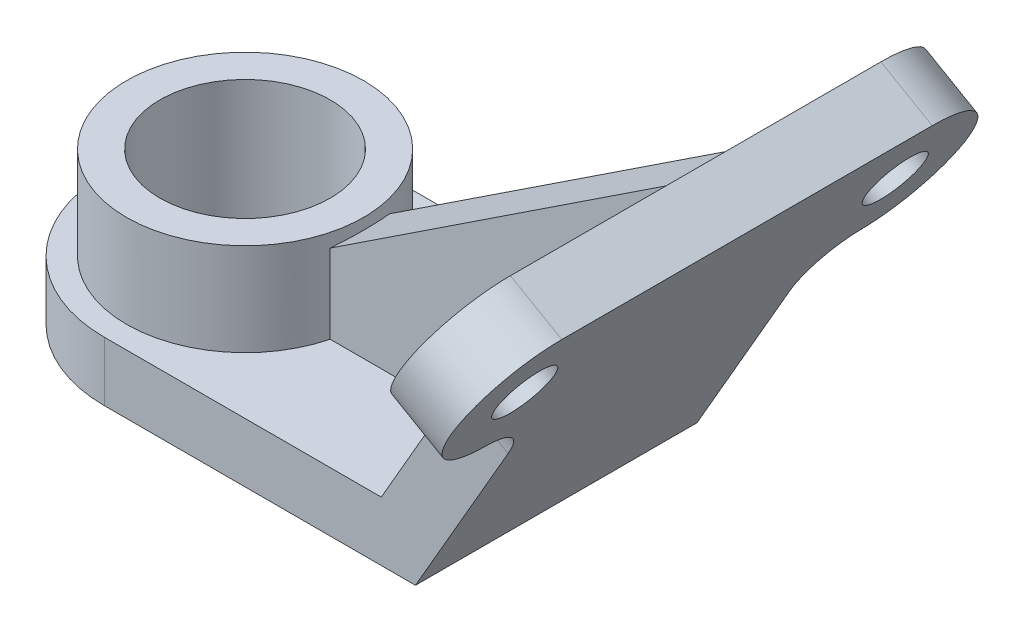
ISO-10303-21;
HEADER;
FILE_DESCRIPTION(('STEP AP214'),'2;1');
FILE_NAME('part.step','',(''),(''),'','','');
FILE_SCHEMA(('AUTOMOTIVE_DESIGN { 1 0 10303 214 1 1 1 1 }'));
ENDSEC;
DATA;
#1=APPLICATION_CONTEXT('core data for automotive mechanical design processes');
#2=APPLICATION_PROTOCOL_DEFINITION('international standard','automotive_design',2000,#1);
#3=PRODUCT_CONTEXT('',#1,'mechanical');
#4=PRODUCT('Part','Part','',(#3));
#5=PRODUCT_RELATED_PRODUCT_CATEGORY('part','',(#4));
#6=PRODUCT_DEFINITION_FORMATION('','',#4);
#7=PRODUCT_DEFINITION_CONTEXT('part definition',#1,'design');
#8=PRODUCT_DEFINITION('design','',#6,#7);
#9=PRODUCT_DEFINITION_SHAPE('','',#8);
#10=(LENGTH_UNIT() NAMED_UNIT(*) SI_UNIT(.MILLI.,.METRE.));
#11=(NAMED_UNIT(*) PLANE_ANGLE_UNIT() SI_UNIT($,.RADIAN.));
#12=(NAMED_UNIT(*) SI_UNIT($,.STERADIAN.) SOLID_ANGLE_UNIT());
#13=UNCERTAINTY_MEASURE_WITH_UNIT(LENGTH_MEASURE(1.E-05),#10,'distance_accuracy_value','');
#14=(GEOMETRIC_REPRESENTATION_CONTEXT(3) GLOBAL_UNCERTAINTY_ASSIGNED_CONTEXT((#13)) GLOBAL_UNIT_ASSIGNED_CONTEXT((#10,
#11,#12)) REPRESENTATION_CONTEXT('',''));
#15=CARTESIAN_POINT('',(0.,0.,0.));
#16=DIRECTION('',(0.,0.,1.));
#17=DIRECTION('',(1.,0.,0.));
#18=AXIS2_PLACEMENT_3D('',#15,#16,#17);
#19=CARTESIAN_POINT('',(95.1435935394489,51.301270189222,51.));
#20=DIRECTION('',(0.86602540378444,-0.499999999999998,0.));
#21=DIRECTION('',(0.499999999999998,0.86602540378444,0.));
#22=AXIS2_PLACEMENT_3D('',#19,#20,#21);
#23=PLANE('',#22);
#24=CARTESIAN_POINT('',(111.643593539449,79.8801085141085,-50.));
#25=DIRECTION('',(-0.86602540378444,0.499999999999998,0.));
#26=DIRECTION('',(-0.499999999999998,-0.86602540378444,0.));
#27=AXIS2_PLACEMENT_3D('',#24,#25,#26);
#28=CIRCLE('',#27,8.00000000000001);
#29=CARTESIAN_POINT('',(107.643593539449,72.951905283833,-50.));
#30=VERTEX_POINT('',#29);
#31=EDGE_CURVE('E217',#30,#30,#28,.T.);
#32=ORIENTED_EDGE('',*,*,#31,.F.);
#33=EDGE_LOOP('',(#32));
#34=FACE_BOUND('',#33,.T.);
#35=DIRECTION('',(-0.499999999999998,-0.86602540378444,0.));
#36=VECTOR('',#35,1.);
#37=CARTESIAN_POINT('',(95.1435935394489,51.301270189222,-8.));
#38=LINE('',#37,#36);
#39=CARTESIAN_POINT('',(121.643593539449,97.2006165897973,-8.));
#40=VERTEX_POINT('',#39);
#41=CARTESIAN_POINT('',(74.762395692966,16.,-8.));
#42=VERTEX_POINT('',#41);
#43=EDGE_CURVE('E170',#40,#42,#38,.T.);
#44=ORIENTED_EDGE('',*,*,#43,.F.);
#45=DIRECTION('',(0.,0.,-1.));
#46=VECTOR('',#45,1.);
#47=CARTESIAN_POINT('',(121.643593539449,97.2006165897973,-50.));
#48=LINE('',#47,#46);
#49=CARTESIAN_POINT('',(121.643593539449,97.2006165897973,-50.));
#50=VERTEX_POINT('',#49);
#51=EDGE_CURVE('E153',#40,#50,#48,.T.);
#52=ORIENTED_EDGE('',*,*,#51,.T.);
#53=CARTESIAN_POINT('',(111.643593539449,79.8801085141085,-50.));
#54=DIRECTION('',(-0.86602540378444,0.499999999999998,0.));
#55=DIRECTION('',(-0.499999999999998,-0.86602540378444,0.));
#56=AXIS2_PLACEMENT_3D('',#53,#54,#55);
#57=CIRCLE('',#56,20.);
#58=CARTESIAN_POINT('',(101.643593539449,62.5596004384197,-50.));
#59=VERTEX_POINT('',#58);
#60=EDGE_CURVE('E238',#50,#59,#57,.T.);
#61=ORIENTED_EDGE('',*,*,#60,.T.);
#62=DIRECTION('',(0.,0.,-1.));
#63=VECTOR('',#62,1.);
#64=CARTESIAN_POINT('',(101.643593539449,62.5596004384197,-51.));
#65=LINE('',#64,#63);
#66=CARTESIAN_POINT('',(101.643593539449,62.5596004384197,-51.));
#67=VERTEX_POINT('',#66);
#68=EDGE_CURVE('E241',#59,#67,#65,.T.);
#69=ORIENTED_EDGE('',*,*,#68,.T.);
#70=CARTESIAN_POINT('',(95.1435935394489,51.301270189222,-51.));
#71=DIRECTION('',(0.86602540378444,-0.499999999999998,0.));
#72=DIRECTION('',(-0.499999999999998,-0.86602540378444,0.));
#73=AXIS2_PLACEMENT_3D('',#70,#71,#72);
#74=CIRCLE('',#73,13.);
#75=CARTESIAN_POINT('',(95.1435935394489,51.301270189222,-38.));
#76=VERTEX_POINT('',#75);
#77=EDGE_CURVE('E244',#67,#76,#74,.T.);
#78=ORIENTED_EDGE('',*,*,#77,.T.);
#79=DIRECTION('',(-0.499999999999998,-0.86602540378444,0.));
#80=VECTOR('',#79,1.);
#81=CARTESIAN_POINT('',(70.143593539449,7.99999999999997,-38.));
#82=LINE('',#81,#80);
#83=CARTESIAN_POINT('',(74.762395692966,16.,-38.));
#84=VERTEX_POINT('',#83);
#85=EDGE_CURVE('E247',#76,#84,#82,.T.);
#86=ORIENTED_EDGE('',*,*,#85,.T.);
#87=DIRECTION('',(0.,0.,-1.));
#88=VECTOR('',#87,1.);
#89=CARTESIAN_POINT('',(74.762395692966,16.,0.));
#90=LINE('',#89,#88);
#91=EDGE_CURVE('E50',#42,#84,#90,.T.);
#92=ORIENTED_EDGE('',*,*,#91,.F.);
#93=EDGE_LOOP('',(#44,#52,#61,#69,#78,#86,#92));
#94=FACE_BOUND('',#93,.T.);
#95=ADVANCED_FACE('F41',(#34,#94),#23,.F.);
#96=CARTESIAN_POINT('',(0.,16.,0.));
#97=DIRECTION('',(0.,1.,0.));
#98=DIRECTION('',(0.,0.,1.));
#99=AXIS2_PLACEMENT_3D('',#96,#97,#98);
#100=PLANE('',#99);
#101=DIRECTION('',(1.,0.,0.));
#102=VECTOR('',#101,1.);
#103=CARTESIAN_POINT('',(0.,16.,8.));
#104=LINE('',#103,#102);
#105=CARTESIAN_POINT('',(30.9838667696593,16.,8.));
#106=VERTEX_POINT('',#105);
#107=CARTESIAN_POINT('',(74.762395692966,16.,8.));
#108=VERTEX_POINT('',#107);
#109=EDGE_CURVE('E200',#106,#108,#104,.T.);
#110=ORIENTED_EDGE('',*,*,#109,.F.);
#111=CARTESIAN_POINT('',(0.,16.,0.));
#112=DIRECTION('',(0.,1.,0.));
#113=DIRECTION('',(0.,0.,1.));
#114=AXIS2_PLACEMENT_3D('',#111,#112,#113);
#115=CIRCLE('',#114,32.);
#116=CARTESIAN_POINT('',(30.9838667696593,16.,-8.));
#117=VERTEX_POINT('',#116);
#118=EDGE_CURVE('E318',#117,#106,#115,.T.);
#119=ORIENTED_EDGE('',*,*,#118,.F.);
#120=DIRECTION('',(1.,0.,0.));
#121=VECTOR('',#120,1.);
#122=CARTESIAN_POINT('',(0.,16.,-8.));
#123=LINE('',#122,#121);
#124=EDGE_CURVE('E176',#117,#42,#123,.T.);
#125=ORIENTED_EDGE('',*,*,#124,.T.);
#126=ORIENTED_EDGE('',*,*,#91,.T.);
#127=DIRECTION('',(1.,0.,0.));
#128=VECTOR('',#127,1.);
#129=CARTESIAN_POINT('',(0.,16.,-38.));
#130=LINE('',#129,#128);
#131=CARTESIAN_POINT('',(0.,16.,-38.));
#132=VERTEX_POINT('',#131);
#133=EDGE_CURVE('E321',#132,#84,#130,.T.);
#134=ORIENTED_EDGE('',*,*,#133,.F.);
#135=CARTESIAN_POINT('',(0.,16.,0.));
#136=DIRECTION('',(0.,1.,0.));
#137=DIRECTION('',(0.,0.,1.));
#138=AXIS2_PLACEMENT_3D('',#135,#136,#137);
#139=CIRCLE('',#138,38.);
#140=CARTESIAN_POINT('',(0.,16.,38.));
#141=VERTEX_POINT('',#140);
#142=EDGE_CURVE('E326',#132,#141,#139,.T.);
#143=ORIENTED_EDGE('',*,*,#142,.T.);
#144=DIRECTION('',(-1.,0.,0.));
#145=VECTOR('',#144,1.);
#146=CARTESIAN_POINT('',(0.,16.,38.));
#147=LINE('',#146,#145);
#148=CARTESIAN_POINT('',(74.7623956929659,16.,38.));
#149=VERTEX_POINT('',#148);
#150=EDGE_CURVE('E330',#149,#141,#147,.T.);
#151=ORIENTED_EDGE('',*,*,#150,.F.);
#152=EDGE_CURVE('E11',#149,#108,#90,.T.);
#153=ORIENTED_EDGE('',*,*,#152,.T.);
#154=EDGE_LOOP('',(#110,#119,#125,#126,#134,#143,#151,#153));
#155=FACE_BOUND('',#154,.T.);
#156=ADVANCED_FACE('F356',(#155),#100,.T.);
#157=CARTESIAN_POINT('',(0.,16.,-38.));
#158=DIRECTION('',(0.,0.,-1.));
#159=DIRECTION('',(-1.,0.,0.));
#160=AXIS2_PLACEMENT_3D('',#157,#158,#159);
#161=PLANE('',#160);
#162=DIRECTION('',(-0.499999999999998,-0.86602540378444,0.));
#163=VECTOR('',#162,1.);
#164=CARTESIAN_POINT('',(84.,0.,-38.));
#165=LINE('',#164,#163);
#166=CARTESIAN_POINT('',(109.,43.301270189222,-38.));
#167=VERTEX_POINT('',#166);
#168=CARTESIAN_POINT('',(84.,0.,-38.));
#169=VERTEX_POINT('',#168);
#170=EDGE_CURVE('E229',#167,#169,#165,.T.);
#171=ORIENTED_EDGE('',*,*,#170,.T.);
#172=DIRECTION('',(1.,0.,0.));
#173=VECTOR('',#172,1.);
#174=CARTESIAN_POINT('',(0.,0.,-38.));
#175=LINE('',#174,#173);
#176=CARTESIAN_POINT('',(0.,0.,-38.));
#177=VERTEX_POINT('',#176);
#178=EDGE_CURVE('E314',#177,#169,#175,.T.);
#179=ORIENTED_EDGE('',*,*,#178,.F.);
#180=DIRECTION('',(0.,-1.,0.));
#181=VECTOR('',#180,1.);
#182=CARTESIAN_POINT('',(0.,16.,-38.));
#183=LINE('',#182,#181);
#184=EDGE_CURVE('E348',#132,#177,#183,.T.);
#185=ORIENTED_EDGE('',*,*,#184,.F.);
#186=ORIENTED_EDGE('',*,*,#133,.T.);
#187=ORIENTED_EDGE('',*,*,#85,.F.);
#188=DIRECTION('',(0.86602540378444,-0.499999999999998,0.));
#189=VECTOR('',#188,1.);
#190=CARTESIAN_POINT('',(95.1435935394489,51.301270189222,-38.));
#191=LINE('',#190,#189);
#192=EDGE_CURVE('E250',#76,#167,#191,.T.);
#193=ORIENTED_EDGE('',*,*,#192,.T.);
#194=EDGE_LOOP('',(#171,#179,#185,#186,#187,#193));
#195=FACE_BOUND('',#194,.T.);
#196=ADVANCED_FACE('F43',(#195),#161,.T.);
#197=CARTESIAN_POINT('',(0.,16.,0.));
#198=DIRECTION('',(0.,-1.,0.));
#199=DIRECTION('',(0.,0.,-1.));
#200=AXIS2_PLACEMENT_3D('',#197,#198,#199);
#201=CYLINDRICAL_SURFACE('',#200,38.);
#202=CARTESIAN_POINT('',(0.,0.,0.));
#203=DIRECTION('',(0.,1.,0.));
#204=DIRECTION('',(0.,0.,1.));
#205=AXIS2_PLACEMENT_3D('',#202,#203,#204);
#206=CIRCLE('',#205,38.);
#207=CARTESIAN_POINT('',(0.,0.,38.));
#208=VERTEX_POINT('',#207);
#209=EDGE_CURVE('E337',#177,#208,#206,.T.);
#210=ORIENTED_EDGE('',*,*,#209,.T.);
#211=DIRECTION('',(0.,-1.,0.));
#212=VECTOR('',#211,1.);
#213=CARTESIAN_POINT('',(0.,16.,38.));
#214=LINE('',#213,#212);
#215=EDGE_CURVE('E333',#141,#208,#214,.T.);
#216=ORIENTED_EDGE('',*,*,#215,.F.);
#217=ORIENTED_EDGE('',*,*,#142,.F.);
#218=ORIENTED_EDGE('',*,*,#184,.T.);
#219=EDGE_LOOP('',(#210,#216,#217,#218));
#220=FACE_BOUND('',#219,.T.);
#221=ADVANCED_FACE('F364',(#220),#201,.T.);
#222=CARTESIAN_POINT('',(0.,16.,38.));
#223=DIRECTION('',(0.,0.,1.));
#224=DIRECTION('',(1.,0.,0.));
#225=AXIS2_PLACEMENT_3D('',#222,#223,#224);
#226=PLANE('',#225);
#227=DIRECTION('',(0.499999999999998,0.86602540378444,0.));
#228=VECTOR('',#227,1.);
#229=CARTESIAN_POINT('',(70.1435935394489,7.99999999999997,38.));
#230=LINE('',#229,#228);
#231=CARTESIAN_POINT('',(95.1435935394489,51.301270189222,38.));
#232=VERTEX_POINT('',#231);
#233=EDGE_CURVE('E225',#149,#232,#230,.T.);
#234=ORIENTED_EDGE('',*,*,#233,.F.);
#235=ORIENTED_EDGE('',*,*,#150,.T.);
#236=ORIENTED_EDGE('',*,*,#215,.T.);
#237=DIRECTION('',(-1.,0.,0.));
#238=VECTOR('',#237,1.);
#239=CARTESIAN_POINT('',(0.,0.,38.));
#240=LINE('',#239,#238);
#241=CARTESIAN_POINT('',(84.,0.,38.));
#242=VERTEX_POINT('',#241);
#243=EDGE_CURVE('E341',#242,#208,#240,.T.);
#244=ORIENTED_EDGE('',*,*,#243,.F.);
#245=DIRECTION('',(0.499999999999998,0.86602540378444,0.));
#246=VECTOR('',#245,1.);
#247=CARTESIAN_POINT('',(84.,0.,38.));
#248=LINE('',#247,#246);
#249=CARTESIAN_POINT('',(109.,43.301270189222,38.));
#250=VERTEX_POINT('',#249);
#251=EDGE_CURVE('E221',#242,#250,#248,.T.);
#252=ORIENTED_EDGE('',*,*,#251,.T.);
#253=DIRECTION('',(0.86602540378444,-0.499999999999998,0.));
#254=VECTOR('',#253,1.);
#255=CARTESIAN_POINT('',(95.1435935394489,51.301270189222,38.));
#256=LINE('',#255,#254);
#257=EDGE_CURVE('E301',#232,#250,#256,.T.);
#258=ORIENTED_EDGE('',*,*,#257,.F.);
#259=EDGE_LOOP('',(#234,#235,#236,#244,#252,#258));
#260=FACE_BOUND('',#259,.T.);
#261=ADVANCED_FACE('F368',(#260),#226,.T.);
#262=CARTESIAN_POINT('',(0.,0.,0.));
#263=DIRECTION('',(0.,1.,0.));
#264=DIRECTION('',(0.,0.,1.));
#265=AXIS2_PLACEMENT_3D('',#262,#263,#264);
#266=PLANE('',#265);
#267=CARTESIAN_POINT('',(0.,0.,0.));
#268=DIRECTION('',(0.,1.,0.));
#269=DIRECTION('',(0.,0.,1.));
#270=AXIS2_PLACEMENT_3D('',#267,#268,#269);
#271=CIRCLE('',#270,23.);
#272=CARTESIAN_POINT('',(0.,0.,23.));
#273=VERTEX_POINT('',#272);
#274=EDGE_CURVE('E305',#273,#273,#271,.T.);
#275=ORIENTED_EDGE('',*,*,#274,.T.);
#276=EDGE_LOOP('',(#275));
#277=FACE_BOUND('',#276,.T.);
#278=DIRECTION('',(0.,0.,1.));
#279=VECTOR('',#278,1.);
#280=CARTESIAN_POINT('',(84.,0.,0.));
#281=LINE('',#280,#279);
#282=EDGE_CURVE('E322',#169,#242,#281,.T.);
#283=ORIENTED_EDGE('',*,*,#282,.T.);
#284=ORIENTED_EDGE('',*,*,#243,.T.);
#285=ORIENTED_EDGE('',*,*,#209,.F.);
#286=ORIENTED_EDGE('',*,*,#178,.T.);
#287=EDGE_LOOP('',(#283,#284,#285,#286));
#288=FACE_BOUND('',#287,.T.);
#289=ADVANCED_FACE('F456',(#277,#288),#266,.F.);
#290=CARTESIAN_POINT('',(0.,41.,0.));
#291=DIRECTION('',(0.,-1.,0.));
#292=DIRECTION('',(0.,0.,-1.));
#293=AXIS2_PLACEMENT_3D('',#290,#291,#292);
#294=CYLINDRICAL_SURFACE('',#293,23.);
#295=ORIENTED_EDGE('',*,*,#274,.F.);
#296=EDGE_LOOP('',(#295));
#297=FACE_BOUND('',#296,.T.);
#298=CARTESIAN_POINT('',(0.,41.,0.));
#299=DIRECTION('',(0.,1.,0.));
#300=DIRECTION('',(0.,0.,1.));
#301=AXIS2_PLACEMENT_3D('',#298,#299,#300);
#302=CIRCLE('',#301,23.);
#303=CARTESIAN_POINT('',(0.,41.,23.));
#304=VERTEX_POINT('',#303);
#305=EDGE_CURVE('E306',#304,#304,#302,.T.);
#306=ORIENTED_EDGE('',*,*,#305,.T.);
#307=EDGE_LOOP('',(#306));
#308=FACE_BOUND('',#307,.T.);
#309=ADVANCED_FACE('F383',(#297,#308),#294,.F.);
#310=CARTESIAN_POINT('',(0.,41.,0.));
#311=DIRECTION('',(0.,-1.,0.));
#312=DIRECTION('',(0.,0.,-1.));
#313=AXIS2_PLACEMENT_3D('',#310,#311,#312);
#314=CYLINDRICAL_SURFACE('',#313,32.);
#315=ORIENTED_EDGE('',*,*,#118,.T.);
#316=DIRECTION('',(0.,-1.,0.));
#317=VECTOR('',#316,1.);
#318=CARTESIAN_POINT('',(30.9838667696593,41.,8.));
#319=LINE('',#318,#317);
#320=CARTESIAN_POINT('',(30.9838667696593,37.328945757322,8.));
#321=VERTEX_POINT('',#320);
#322=EDGE_CURVE('E57',#106,#321,#319,.F.);
#323=ORIENTED_EDGE('',*,*,#322,.T.);
#324=CARTESIAN_POINT('',(0.,16.8672044919769,0.));
#325=DIRECTION('',(-0.551074609132322,0.834455975573102,0.));
#326=DIRECTION('',(-0.834455975573102,-0.551074609132322,0.));
#327=AXIS2_PLACEMENT_3D('',#324,#325,#326);
#328=ELLIPSE('',#327,38.3483382427964,32.);
#329=CARTESIAN_POINT('',(30.9838667696593,37.328945757322,-8.));
#330=VERTEX_POINT('',#329);
#331=EDGE_CURVE('E61',#321,#330,#328,.T.);
#332=ORIENTED_EDGE('',*,*,#331,.T.);
#333=DIRECTION('',(0.,-1.,0.));
#334=VECTOR('',#333,1.);
#335=CARTESIAN_POINT('',(30.9838667696593,41.,-8.));
#336=LINE('',#335,#334);
#337=EDGE_CURVE('E187',#117,#330,#336,.F.);
#338=ORIENTED_EDGE('',*,*,#337,.F.);
#339=EDGE_LOOP('',(#315,#323,#332,#338));
#340=FACE_BOUND('',#339,.T.);
#341=CARTESIAN_POINT('',(0.,41.,0.));
#342=DIRECTION('',(0.,1.,0.));
#343=DIRECTION('',(0.,0.,1.));
#344=AXIS2_PLACEMENT_3D('',#341,#342,#343);
#345=CIRCLE('',#344,32.);
#346=CARTESIAN_POINT('',(0.,41.,32.));
#347=VERTEX_POINT('',#346);
#348=EDGE_CURVE('E310',#347,#347,#345,.T.);
#349=ORIENTED_EDGE('',*,*,#348,.F.);
#350=EDGE_LOOP('',(#349));
#351=FACE_BOUND('',#350,.T.);
#352=ADVANCED_FACE('F379',(#340,#351),#314,.T.);
#353=CARTESIAN_POINT('',(0.,41.,0.));
#354=DIRECTION('',(0.,1.,0.));
#355=DIRECTION('',(0.,0.,1.));
#356=AXIS2_PLACEMENT_3D('',#353,#354,#355);
#357=PLANE('',#356);
#358=ORIENTED_EDGE('',*,*,#305,.F.);
#359=EDGE_LOOP('',(#358));
#360=FACE_BOUND('',#359,.T.);
#361=ORIENTED_EDGE('',*,*,#348,.T.);
#362=EDGE_LOOP('',(#361));
#363=FACE_BOUND('',#362,.T.);
#364=ADVANCED_FACE('F382',(#360,#363),#357,.T.);
#365=CARTESIAN_POINT('',(121.643593539449,97.2006165897973,50.));
#366=VERTEX_POINT('',#365);
#367=CARTESIAN_POINT('',(121.643593539449,97.2006165897973,8.));
#368=VERTEX_POINT('',#367);
#369=EDGE_CURVE('E167',#366,#368,#48,.T.);
#370=ORIENTED_EDGE('',*,*,#369,.T.);
#371=DIRECTION('',(-0.499999999999998,-0.86602540378444,0.));
#372=VECTOR('',#371,1.);
#373=CARTESIAN_POINT('',(95.1435935394489,51.301270189222,8.));
#374=LINE('',#373,#372);
#375=EDGE_CURVE('E197',#368,#108,#374,.T.);
#376=ORIENTED_EDGE('',*,*,#375,.T.);
#377=ORIENTED_EDGE('',*,*,#152,.F.);
#378=ORIENTED_EDGE('',*,*,#233,.T.);
#379=CARTESIAN_POINT('',(95.1435935394489,51.301270189222,51.));
#380=DIRECTION('',(0.86602540378444,-0.499999999999998,0.));
#381=DIRECTION('',(0.499999999999998,0.86602540378444,0.));
#382=AXIS2_PLACEMENT_3D('',#379,#380,#381);
#383=CIRCLE('',#382,13.);
#384=CARTESIAN_POINT('',(101.643593539449,62.5596004384197,51.));
#385=VERTEX_POINT('',#384);
#386=EDGE_CURVE('E228',#232,#385,#383,.T.);
#387=ORIENTED_EDGE('',*,*,#386,.T.);
#388=DIRECTION('',(0.,0.,-1.));
#389=VECTOR('',#388,1.);
#390=CARTESIAN_POINT('',(101.643593539449,62.5596004384197,51.));
#391=LINE('',#390,#389);
#392=CARTESIAN_POINT('',(101.643593539449,62.5596004384197,50.));
#393=VERTEX_POINT('',#392);
#394=EDGE_CURVE('E232',#385,#393,#391,.T.);
#395=ORIENTED_EDGE('',*,*,#394,.T.);
#396=CARTESIAN_POINT('',(111.643593539449,79.8801085141085,50.));
#397=DIRECTION('',(-0.86602540378444,0.499999999999998,0.));
#398=DIRECTION('',(0.499999999999998,0.86602540378444,0.));
#399=AXIS2_PLACEMENT_3D('',#396,#397,#398);
#400=CIRCLE('',#399,20.);
#401=EDGE_CURVE('E165',#393,#366,#400,.T.);
#402=ORIENTED_EDGE('',*,*,#401,.T.);
#403=EDGE_LOOP('',(#370,#376,#377,#378,#387,#395,#402));
#404=FACE_BOUND('',#403,.T.);
#405=CARTESIAN_POINT('',(111.643593539449,79.8801085141085,50.));
#406=DIRECTION('',(-0.86602540378444,0.499999999999998,0.));
#407=DIRECTION('',(0.499999999999998,0.86602540378444,0.));
#408=AXIS2_PLACEMENT_3D('',#405,#406,#407);
#409=CIRCLE('',#408,8.00000000000001);
#410=CARTESIAN_POINT('',(115.643593539449,86.808311744384,50.));
#411=VERTEX_POINT('',#410);
#412=EDGE_CURVE('E209',#411,#411,#409,.T.);
#413=ORIENTED_EDGE('',*,*,#412,.F.);
#414=EDGE_LOOP('',(#413));
#415=FACE_BOUND('',#414,.T.);
#416=ADVANCED_FACE('F373',(#404,#415),#23,.F.);
#417=CARTESIAN_POINT('',(109.,43.301270189222,51.));
#418=DIRECTION('',(0.86602540378444,-0.499999999999998,0.));
#419=DIRECTION('',(0.499999999999998,0.86602540378444,0.));
#420=AXIS2_PLACEMENT_3D('',#417,#418,#419);
#421=PLANE('',#420);
#422=ORIENTED_EDGE('',*,*,#251,.F.);
#423=ORIENTED_EDGE('',*,*,#282,.F.);
#424=ORIENTED_EDGE('',*,*,#170,.F.);
#425=CARTESIAN_POINT('',(109.,43.301270189222,-51.));
#426=DIRECTION('',(0.86602540378444,-0.499999999999998,0.));
#427=DIRECTION('',(-0.499999999999998,-0.86602540378444,0.));
#428=AXIS2_PLACEMENT_3D('',#425,#426,#427);
#429=CIRCLE('',#428,13.);
#430=CARTESIAN_POINT('',(115.5,54.5596004384197,-51.));
#431=VERTEX_POINT('',#430);
#432=EDGE_CURVE('E271',#431,#167,#429,.T.);
#433=ORIENTED_EDGE('',*,*,#432,.F.);
#434=DIRECTION('',(0.,0.,-1.));
#435=VECTOR('',#434,1.);
#436=CARTESIAN_POINT('',(115.5,54.5596004384197,-51.));
#437=LINE('',#436,#435);
#438=CARTESIAN_POINT('',(115.5,54.5596004384197,-50.));
#439=VERTEX_POINT('',#438);
#440=EDGE_CURVE('E268',#439,#431,#437,.T.);
#441=ORIENTED_EDGE('',*,*,#440,.F.);
#442=CARTESIAN_POINT('',(125.5,71.8801085141085,-50.));
#443=DIRECTION('',(-0.86602540378444,0.499999999999998,0.));
#444=DIRECTION('',(-0.499999999999998,-0.86602540378444,0.));
#445=AXIS2_PLACEMENT_3D('',#442,#443,#444);
#446=CIRCLE('',#445,20.);
#447=CARTESIAN_POINT('',(135.5,89.2006165897973,-50.));
#448=VERTEX_POINT('',#447);
#449=EDGE_CURVE('E265',#448,#439,#446,.T.);
#450=ORIENTED_EDGE('',*,*,#449,.F.);
#451=DIRECTION('',(0.,0.,-1.));
#452=VECTOR('',#451,1.);
#453=CARTESIAN_POINT('',(135.5,89.2006165897973,-50.));
#454=LINE('',#453,#452);
#455=CARTESIAN_POINT('',(135.5,89.2006165897973,50.));
#456=VERTEX_POINT('',#455);
#457=EDGE_CURVE('E262',#456,#448,#454,.T.);
#458=ORIENTED_EDGE('',*,*,#457,.F.);
#459=CARTESIAN_POINT('',(125.5,71.8801085141085,50.));
#460=DIRECTION('',(-0.86602540378444,0.499999999999998,0.));
#461=DIRECTION('',(0.499999999999998,0.86602540378444,0.));
#462=AXIS2_PLACEMENT_3D('',#459,#460,#461);
#463=CIRCLE('',#462,20.);
#464=CARTESIAN_POINT('',(115.5,54.5596004384197,50.));
#465=VERTEX_POINT('',#464);
#466=EDGE_CURVE('E259',#465,#456,#463,.T.);
#467=ORIENTED_EDGE('',*,*,#466,.F.);
#468=DIRECTION('',(0.,0.,-1.));
#469=VECTOR('',#468,1.);
#470=CARTESIAN_POINT('',(115.5,54.5596004384197,51.));
#471=LINE('',#470,#469);
#472=CARTESIAN_POINT('',(115.5,54.5596004384197,51.));
#473=VERTEX_POINT('',#472);
#474=EDGE_CURVE('E256',#473,#465,#471,.T.);
#475=ORIENTED_EDGE('',*,*,#474,.F.);
#476=CARTESIAN_POINT('',(109.,43.301270189222,51.));
#477=DIRECTION('',(0.86602540378444,-0.499999999999998,0.));
#478=DIRECTION('',(0.499999999999998,0.86602540378444,0.));
#479=AXIS2_PLACEMENT_3D('',#476,#477,#478);
#480=CIRCLE('',#479,13.);
#481=EDGE_CURVE('E253',#250,#473,#480,.T.);
#482=ORIENTED_EDGE('',*,*,#481,.F.);
#483=EDGE_LOOP('',(#422,#423,#424,#433,#441,#450,#458,#467,#475,#482));
#484=FACE_BOUND('',#483,.T.);
#485=CARTESIAN_POINT('',(125.5,71.8801085141085,50.));
#486=DIRECTION('',(-0.86602540378444,0.499999999999998,0.));
#487=DIRECTION('',(0.499999999999998,0.86602540378444,0.));
#488=AXIS2_PLACEMENT_3D('',#485,#486,#487);
#489=CIRCLE('',#488,8.00000000000001);
#490=CARTESIAN_POINT('',(129.5,78.8083117443841,50.));
#491=VERTEX_POINT('',#490);
#492=EDGE_CURVE('E208',#491,#491,#489,.T.);
#493=ORIENTED_EDGE('',*,*,#492,.T.);
#494=EDGE_LOOP('',(#493));
#495=FACE_BOUND('',#494,.T.);
#496=CARTESIAN_POINT('',(125.5,71.8801085141085,-50.));
#497=DIRECTION('',(-0.86602540378444,0.499999999999998,0.));
#498=DIRECTION('',(-0.499999999999998,-0.86602540378444,0.));
#499=AXIS2_PLACEMENT_3D('',#496,#497,#498);
#500=CIRCLE('',#499,8.00000000000001);
#501=CARTESIAN_POINT('',(121.5,64.951905283833,-50.));
#502=VERTEX_POINT('',#501);
#503=EDGE_CURVE('E213',#502,#502,#500,.T.);
#504=ORIENTED_EDGE('',*,*,#503,.T.);
#505=EDGE_LOOP('',(#504));
#506=FACE_BOUND('',#505,.T.);
#507=ADVANCED_FACE('F393',(#484,#495,#506),#421,.T.);
#508=CARTESIAN_POINT('',(95.1435935394489,51.301270189222,51.));
#509=DIRECTION('',(0.86602540378444,-0.499999999999998,0.));
#510=DIRECTION('',(0.499999999999998,0.86602540378444,0.));
#511=AXIS2_PLACEMENT_3D('',#508,#509,#510);
#512=CYLINDRICAL_SURFACE('',#511,13.);
#513=ORIENTED_EDGE('',*,*,#481,.T.);
#514=DIRECTION('',(0.86602540378444,-0.499999999999998,0.));
#515=VECTOR('',#514,1.);
#516=CARTESIAN_POINT('',(101.643593539449,62.5596004384197,51.));
#517=LINE('',#516,#515);
#518=EDGE_CURVE('E297',#385,#473,#517,.T.);
#519=ORIENTED_EDGE('',*,*,#518,.F.);
#520=ORIENTED_EDGE('',*,*,#386,.F.);
#521=ORIENTED_EDGE('',*,*,#257,.T.);
#522=EDGE_LOOP('',(#513,#519,#520,#521));
#523=FACE_BOUND('',#522,.T.);
#524=ADVANCED_FACE('F410',(#523),#512,.F.);
#525=CARTESIAN_POINT('',(101.643593539449,62.5596004384197,51.));
#526=DIRECTION('',(-0.499999999999998,-0.86602540378444,0.));
#527=DIRECTION('',(0.86602540378444,-0.499999999999998,0.));
#528=AXIS2_PLACEMENT_3D('',#525,#526,#527);
#529=PLANE('',#528);
#530=ORIENTED_EDGE('',*,*,#474,.T.);
#531=DIRECTION('',(0.86602540378444,-0.499999999999998,0.));
#532=VECTOR('',#531,1.);
#533=CARTESIAN_POINT('',(101.643593539449,62.5596004384197,50.));
#534=LINE('',#533,#532);
#535=EDGE_CURVE('E293',#393,#465,#534,.T.);
#536=ORIENTED_EDGE('',*,*,#535,.F.);
#537=ORIENTED_EDGE('',*,*,#394,.F.);
#538=ORIENTED_EDGE('',*,*,#518,.T.);
#539=EDGE_LOOP('',(#530,#536,#537,#538));
#540=FACE_BOUND('',#539,.T.);
#541=ADVANCED_FACE('F429',(#540),#529,.F.);
#542=CARTESIAN_POINT('',(111.643593539449,79.8801085141085,50.));
#543=DIRECTION('',(0.86602540378444,-0.499999999999998,0.));
#544=DIRECTION('',(0.499999999999998,0.86602540378444,0.));
#545=AXIS2_PLACEMENT_3D('',#542,#543,#544);
#546=CYLINDRICAL_SURFACE('',#545,20.);
#547=ORIENTED_EDGE('',*,*,#466,.T.);
#548=DIRECTION('',(0.86602540378444,-0.499999999999998,0.));
#549=VECTOR('',#548,1.);
#550=CARTESIAN_POINT('',(121.643593539449,97.2006165897973,50.));
#551=LINE('',#550,#549);
#552=EDGE_CURVE('E289',#366,#456,#551,.T.);
#553=ORIENTED_EDGE('',*,*,#552,.F.);
#554=ORIENTED_EDGE('',*,*,#401,.F.);
#555=ORIENTED_EDGE('',*,*,#535,.T.);
#556=EDGE_LOOP('',(#547,#553,#554,#555));
#557=FACE_BOUND('',#556,.T.);
#558=ADVANCED_FACE('F426',(#557),#546,.T.);
#559=CARTESIAN_POINT('',(121.643593539449,97.2006165897973,-50.));
#560=DIRECTION('',(-0.499999999999998,-0.86602540378444,0.));
#561=DIRECTION('',(0.86602540378444,-0.499999999999998,0.));
#562=AXIS2_PLACEMENT_3D('',#559,#560,#561);
#563=PLANE('',#562);
#564=ORIENTED_EDGE('',*,*,#457,.T.);
#565=DIRECTION('',(0.86602540378444,-0.499999999999998,0.));
#566=VECTOR('',#565,1.);
#567=CARTESIAN_POINT('',(121.643593539449,97.2006165897973,-50.));
#568=LINE('',#567,#566);
#569=EDGE_CURVE('E161',#50,#448,#568,.T.);
#570=ORIENTED_EDGE('',*,*,#569,.F.);
#571=ORIENTED_EDGE('',*,*,#51,.F.);
#572=EDGE_CURVE('E158',#368,#40,#48,.T.);
#573=ORIENTED_EDGE('',*,*,#572,.F.);
#574=ORIENTED_EDGE('',*,*,#369,.F.);
#575=ORIENTED_EDGE('',*,*,#552,.T.);
#576=EDGE_LOOP('',(#564,#570,#571,#573,#574,#575));
#577=FACE_BOUND('',#576,.T.);
#578=ADVANCED_FACE('F155',(#577),#563,.F.);
#579=CARTESIAN_POINT('',(111.643593539449,79.8801085141085,-50.));
#580=DIRECTION('',(0.86602540378444,-0.499999999999998,0.));
#581=DIRECTION('',(0.499999999999998,0.86602540378444,0.));
#582=AXIS2_PLACEMENT_3D('',#579,#580,#581);
#583=CYLINDRICAL_SURFACE('',#582,20.);
#584=ORIENTED_EDGE('',*,*,#449,.T.);
#585=DIRECTION('',(0.86602540378444,-0.499999999999998,0.));
#586=VECTOR('',#585,1.);
#587=CARTESIAN_POINT('',(101.643593539449,62.5596004384197,-50.));
#588=LINE('',#587,#586);
#589=EDGE_CURVE('E283',#59,#439,#588,.T.);
#590=ORIENTED_EDGE('',*,*,#589,.F.);
#591=ORIENTED_EDGE('',*,*,#60,.F.);
#592=ORIENTED_EDGE('',*,*,#569,.T.);
#593=EDGE_LOOP('',(#584,#590,#591,#592));
#594=FACE_BOUND('',#593,.T.);
#595=ADVANCED_FACE('F419',(#594),#583,.T.);
#596=CARTESIAN_POINT('',(101.643593539449,62.5596004384197,-51.));
#597=DIRECTION('',(-0.499999999999998,-0.86602540378444,0.));
#598=DIRECTION('',(0.86602540378444,-0.499999999999998,0.));
#599=AXIS2_PLACEMENT_3D('',#596,#597,#598);
#600=PLANE('',#599);
#601=ORIENTED_EDGE('',*,*,#440,.T.);
#602=DIRECTION('',(0.86602540378444,-0.499999999999998,0.));
#603=VECTOR('',#602,1.);
#604=CARTESIAN_POINT('',(101.643593539449,62.5596004384197,-51.));
#605=LINE('',#604,#603);
#606=EDGE_CURVE('E279',#67,#431,#605,.T.);
#607=ORIENTED_EDGE('',*,*,#606,.F.);
#608=ORIENTED_EDGE('',*,*,#68,.F.);
#609=ORIENTED_EDGE('',*,*,#589,.T.);
#610=EDGE_LOOP('',(#601,#607,#608,#609));
#611=FACE_BOUND('',#610,.T.);
#612=ADVANCED_FACE('F415',(#611),#600,.F.);
#613=CARTESIAN_POINT('',(95.1435935394489,51.301270189222,-51.));
#614=DIRECTION('',(0.86602540378444,-0.499999999999998,0.));
#615=DIRECTION('',(0.499999999999998,0.86602540378444,0.));
#616=AXIS2_PLACEMENT_3D('',#613,#614,#615);
#617=CYLINDRICAL_SURFACE('',#616,13.);
#618=ORIENTED_EDGE('',*,*,#432,.T.);
#619=ORIENTED_EDGE('',*,*,#192,.F.);
#620=ORIENTED_EDGE('',*,*,#77,.F.);
#621=ORIENTED_EDGE('',*,*,#606,.T.);
#622=EDGE_LOOP('',(#618,#619,#620,#621));
#623=FACE_BOUND('',#622,.T.);
#624=ADVANCED_FACE('F412',(#623),#617,.F.);
#625=CARTESIAN_POINT('',(111.643593539449,79.8801085141085,-50.));
#626=DIRECTION('',(0.86602540378444,-0.499999999999998,0.));
#627=DIRECTION('',(0.499999999999998,0.86602540378444,0.));
#628=AXIS2_PLACEMENT_3D('',#625,#626,#627);
#629=CYLINDRICAL_SURFACE('',#628,8.00000000000001);
#630=ORIENTED_EDGE('',*,*,#31,.T.);
#631=EDGE_LOOP('',(#630));
#632=FACE_BOUND('',#631,.T.);
#633=ORIENTED_EDGE('',*,*,#503,.F.);
#634=EDGE_LOOP('',(#633));
#635=FACE_BOUND('',#634,.T.);
#636=ADVANCED_FACE('F406',(#632,#635),#629,.F.);
#637=CARTESIAN_POINT('',(111.643593539449,79.8801085141085,50.));
#638=DIRECTION('',(0.86602540378444,-0.499999999999998,0.));
#639=DIRECTION('',(0.499999999999998,0.86602540378444,0.));
#640=AXIS2_PLACEMENT_3D('',#637,#638,#639);
#641=CYLINDRICAL_SURFACE('',#640,8.00000000000001);
#642=ORIENTED_EDGE('',*,*,#412,.T.);
#643=EDGE_LOOP('',(#642));
#644=FACE_BOUND('',#643,.T.);
#645=ORIENTED_EDGE('',*,*,#492,.F.);
#646=EDGE_LOOP('',(#645));
#647=FACE_BOUND('',#646,.T.);
#648=ADVANCED_FACE('F530',(#644,#647),#641,.F.);
#649=CARTESIAN_POINT('',(121.643593539449,97.2006165897973,0.));
#650=DIRECTION('',(-0.551074609132322,0.834455975573102,0.));
#651=DIRECTION('',(-0.834455975573102,-0.551074609132322,0.));
#652=AXIS2_PLACEMENT_3D('',#649,#650,#651);
#653=PLANE('',#652);
#654=ORIENTED_EDGE('',*,*,#331,.F.);
#655=DIRECTION('',(-0.834455975573102,-0.551074609132322,0.));
#656=VECTOR('',#655,1.);
#657=CARTESIAN_POINT('',(121.643593539449,97.2006165897973,8.));
#658=LINE('',#657,#656);
#659=EDGE_CURVE('E177',#368,#321,#658,.T.);
#660=ORIENTED_EDGE('',*,*,#659,.F.);
#661=ORIENTED_EDGE('',*,*,#572,.T.);
#662=DIRECTION('',(-0.834455975573102,-0.551074609132322,0.));
#663=VECTOR('',#662,1.);
#664=CARTESIAN_POINT('',(121.643593539449,97.2006165897973,-8.));
#665=LINE('',#664,#663);
#666=EDGE_CURVE('E183',#40,#330,#665,.T.);
#667=ORIENTED_EDGE('',*,*,#666,.T.);
#668=EDGE_LOOP('',(#654,#660,#661,#667));
#669=FACE_BOUND('',#668,.T.);
#670=ADVANCED_FACE('F182',(#669),#653,.T.);
#671=CARTESIAN_POINT('',(48.7499999999999,48.6003082948986,8.));
#672=DIRECTION('',(0.,0.,1.));
#673=DIRECTION('',(1.,0.,0.));
#674=AXIS2_PLACEMENT_3D('',#671,#672,#673);
#675=PLANE('',#674);
#676=ORIENTED_EDGE('',*,*,#322,.F.);
#677=ORIENTED_EDGE('',*,*,#109,.T.);
#678=ORIENTED_EDGE('',*,*,#375,.F.);
#679=ORIENTED_EDGE('',*,*,#659,.T.);
#680=EDGE_LOOP('',(#676,#677,#678,#679));
#681=FACE_BOUND('',#680,.T.);
#682=ADVANCED_FACE('F378',(#681),#675,.T.);
#683=CARTESIAN_POINT('',(48.7499999999999,48.6003082948986,-8.));
#684=DIRECTION('',(0.,0.,1.));
#685=DIRECTION('',(1.,0.,0.));
#686=AXIS2_PLACEMENT_3D('',#683,#684,#685);
#687=PLANE('',#686);
#688=ORIENTED_EDGE('',*,*,#124,.F.);
#689=ORIENTED_EDGE('',*,*,#337,.T.);
#690=ORIENTED_EDGE('',*,*,#666,.F.);
#691=ORIENTED_EDGE('',*,*,#43,.T.);
#692=EDGE_LOOP('',(#688,#689,#690,#691));
#693=FACE_BOUND('',#692,.T.);
#694=ADVANCED_FACE('F186',(#693),#687,.F.);
#695=CLOSED_SHELL('',(#95,#156,#196,#221,#261,#289,#309,#352,#364,#416,#507,#524,#541,#558,#578,
#595,#612,#624,#636,#648,#670,#682,#694));
#696=MANIFOLD_SOLID_BREP('B2',#695);
#697=ADVANCED_BREP_SHAPE_REPRESENTATION('',(#18,#696),#14);
#698=SHAPE_DEFINITION_REPRESENTATION(#9,#697);
ENDSEC;
END-ISO-10303-21;
